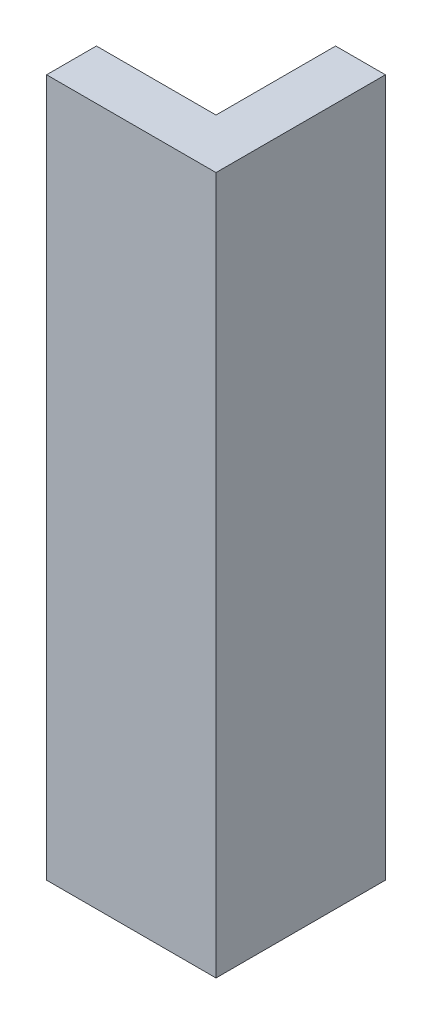
ISO-10303-21;
HEADER;
FILE_DESCRIPTION(('STEP AP214'),'2;1');
FILE_NAME('part.step','',(''),(''),'','','');
FILE_SCHEMA(('AUTOMOTIVE_DESIGN { 1 0 10303 214 1 1 1 1 }'));
ENDSEC;
DATA;
#1=APPLICATION_CONTEXT('core data for automotive mechanical design processes');
#2=APPLICATION_PROTOCOL_DEFINITION('international standard','automotive_design',2000,#1);
#3=PRODUCT_CONTEXT('',#1,'mechanical');
#4=PRODUCT('Part','Part','',(#3));
#5=PRODUCT_RELATED_PRODUCT_CATEGORY('part','',(#4));
#6=PRODUCT_DEFINITION_FORMATION('','',#4);
#7=PRODUCT_DEFINITION_CONTEXT('part definition',#1,'design');
#8=PRODUCT_DEFINITION('design','',#6,#7);
#9=PRODUCT_DEFINITION_SHAPE('','',#8);
#10=(LENGTH_UNIT() NAMED_UNIT(*) SI_UNIT(.MILLI.,.METRE.));
#11=(NAMED_UNIT(*) PLANE_ANGLE_UNIT() SI_UNIT($,.RADIAN.));
#12=(NAMED_UNIT(*) SI_UNIT($,.STERADIAN.) SOLID_ANGLE_UNIT());
#13=UNCERTAINTY_MEASURE_WITH_UNIT(LENGTH_MEASURE(1.E-05),#10,'distance_accuracy_value','');
#14=(GEOMETRIC_REPRESENTATION_CONTEXT(3) GLOBAL_UNCERTAINTY_ASSIGNED_CONTEXT((#13)) GLOBAL_UNIT_ASSIGNED_CONTEXT((#10,
#11,#12)) REPRESENTATION_CONTEXT('',''));
#15=CARTESIAN_POINT('',(0.,0.,0.));
#16=DIRECTION('',(0.,0.,1.));
#17=DIRECTION('',(1.,0.,0.));
#18=AXIS2_PLACEMENT_3D('',#15,#16,#17);
#19=CARTESIAN_POINT('',(0.,70.,0.));
#20=DIRECTION('',(1.,0.,0.));
#21=DIRECTION('',(0.,0.,-1.));
#22=AXIS2_PLACEMENT_3D('',#19,#20,#21);
#23=PLANE('',#22);
#24=DIRECTION('',(0.,0.,1.));
#25=VECTOR('',#24,1.);
#26=CARTESIAN_POINT('',(0.,70.,0.));
#27=LINE('',#26,#25);
#28=CARTESIAN_POINT('',(0.,70.,12.));
#29=VERTEX_POINT('',#28);
#30=CARTESIAN_POINT('',(0.,70.,17.));
#31=VERTEX_POINT('',#30);
#32=EDGE_CURVE('E90',#29,#31,#27,.T.);
#33=ORIENTED_EDGE('',*,*,#32,.F.);
#34=DIRECTION('',(0.,1.,0.));
#35=VECTOR('',#34,1.);
#36=CARTESIAN_POINT('',(0.,4.,12.));
#37=LINE('',#36,#35);
#38=CARTESIAN_POINT('',(0.,4.,12.));
#39=VERTEX_POINT('',#38);
#40=EDGE_CURVE('E56',#39,#29,#37,.T.);
#41=ORIENTED_EDGE('',*,*,#40,.F.);
#42=DIRECTION('',(0.,0.,1.));
#43=VECTOR('',#42,1.);
#44=CARTESIAN_POINT('',(0.,4.,0.));
#45=LINE('',#44,#43);
#46=CARTESIAN_POINT('',(0.,4.,0.));
#47=VERTEX_POINT('',#46);
#48=EDGE_CURVE('E118',#47,#39,#45,.T.);
#49=ORIENTED_EDGE('',*,*,#48,.F.);
#50=DIRECTION('',(0.,-1.,0.));
#51=VECTOR('',#50,1.);
#52=CARTESIAN_POINT('',(0.,70.,0.));
#53=LINE('',#52,#51);
#54=CARTESIAN_POINT('',(0.,0.,0.));
#55=VERTEX_POINT('',#54);
#56=EDGE_CURVE('E86',#47,#55,#53,.T.);
#57=ORIENTED_EDGE('',*,*,#56,.T.);
#58=DIRECTION('',(0.,0.,1.));
#59=VECTOR('',#58,1.);
#60=CARTESIAN_POINT('',(0.,0.,0.));
#61=LINE('',#60,#59);
#62=CARTESIAN_POINT('',(0.,0.,17.));
#63=VERTEX_POINT('',#62);
#64=EDGE_CURVE('E147',#55,#63,#61,.T.);
#65=ORIENTED_EDGE('',*,*,#64,.T.);
#66=DIRECTION('',(0.,-1.,0.));
#67=VECTOR('',#66,1.);
#68=CARTESIAN_POINT('',(0.,70.,17.));
#69=LINE('',#68,#67);
#70=EDGE_CURVE('E11',#31,#63,#69,.T.);
#71=ORIENTED_EDGE('',*,*,#70,.F.);
#72=EDGE_LOOP('',(#33,#41,#49,#57,#65,#71));
#73=FACE_BOUND('',#72,.T.);
#74=ADVANCED_FACE('F39',(#73),#23,.F.);
#75=CARTESIAN_POINT('',(0.,70.,17.));
#76=DIRECTION('',(0.,0.,-1.));
#77=DIRECTION('',(-1.,0.,0.));
#78=AXIS2_PLACEMENT_3D('',#75,#76,#77);
#79=PLANE('',#78);
#80=DIRECTION('',(1.,0.,0.));
#81=VECTOR('',#80,1.);
#82=CARTESIAN_POINT('',(0.,0.,17.));
#83=LINE('',#82,#81);
#84=CARTESIAN_POINT('',(17.,0.,17.));
#85=VERTEX_POINT('',#84);
#86=EDGE_CURVE('E150',#63,#85,#83,.T.);
#87=ORIENTED_EDGE('',*,*,#86,.T.);
#88=DIRECTION('',(0.,-1.,0.));
#89=VECTOR('',#88,1.);
#90=CARTESIAN_POINT('',(17.,70.,17.));
#91=LINE('',#90,#89);
#92=CARTESIAN_POINT('',(17.,70.,17.));
#93=VERTEX_POINT('',#92);
#94=EDGE_CURVE('E48',#93,#85,#91,.T.);
#95=ORIENTED_EDGE('',*,*,#94,.F.);
#96=DIRECTION('',(1.,0.,0.));
#97=VECTOR('',#96,1.);
#98=CARTESIAN_POINT('',(0.,70.,17.));
#99=LINE('',#98,#97);
#100=EDGE_CURVE('E138',#31,#93,#99,.T.);
#101=ORIENTED_EDGE('',*,*,#100,.F.);
#102=ORIENTED_EDGE('',*,*,#70,.T.);
#103=EDGE_LOOP('',(#87,#95,#101,#102));
#104=FACE_BOUND('',#103,.T.);
#105=ADVANCED_FACE('F230',(#104),#79,.F.);
#106=CARTESIAN_POINT('',(17.,70.,0.));
#107=DIRECTION('',(-1.,0.,0.));
#108=DIRECTION('',(0.,0.,1.));
#109=AXIS2_PLACEMENT_3D('',#106,#107,#108);
#110=PLANE('',#109);
#111=DIRECTION('',(0.,0.,-1.));
#112=VECTOR('',#111,1.);
#113=CARTESIAN_POINT('',(17.,0.,0.));
#114=LINE('',#113,#112);
#115=CARTESIAN_POINT('',(17.,0.,0.));
#116=VERTEX_POINT('',#115);
#117=EDGE_CURVE('E153',#85,#116,#114,.T.);
#118=ORIENTED_EDGE('',*,*,#117,.T.);
#119=DIRECTION('',(0.,-1.,0.));
#120=VECTOR('',#119,1.);
#121=CARTESIAN_POINT('',(17.,70.,0.));
#122=LINE('',#121,#120);
#123=CARTESIAN_POINT('',(17.,70.,0.));
#124=VERTEX_POINT('',#123);
#125=EDGE_CURVE('E160',#124,#116,#122,.T.);
#126=ORIENTED_EDGE('',*,*,#125,.F.);
#127=DIRECTION('',(0.,0.,-1.));
#128=VECTOR('',#127,1.);
#129=CARTESIAN_POINT('',(17.,70.,0.));
#130=LINE('',#129,#128);
#131=EDGE_CURVE('E65',#93,#124,#130,.T.);
#132=ORIENTED_EDGE('',*,*,#131,.F.);
#133=ORIENTED_EDGE('',*,*,#94,.T.);
#134=EDGE_LOOP('',(#118,#126,#132,#133));
#135=FACE_BOUND('',#134,.T.);
#136=ADVANCED_FACE('F233',(#135),#110,.F.);
#137=CARTESIAN_POINT('',(0.,70.,0.));
#138=DIRECTION('',(0.,0.,1.));
#139=DIRECTION('',(1.,0.,0.));
#140=AXIS2_PLACEMENT_3D('',#137,#138,#139);
#141=PLANE('',#140);
#142=DIRECTION('',(-1.,0.,0.));
#143=VECTOR('',#142,1.);
#144=CARTESIAN_POINT('',(0.,4.,0.));
#145=LINE('',#144,#143);
#146=CARTESIAN_POINT('',(12.,4.,0.));
#147=VERTEX_POINT('',#146);
#148=EDGE_CURVE('E122',#147,#47,#145,.T.);
#149=ORIENTED_EDGE('',*,*,#148,.F.);
#150=DIRECTION('',(0.,1.,0.));
#151=VECTOR('',#150,1.);
#152=CARTESIAN_POINT('',(12.,4.,0.));
#153=LINE('',#152,#151);
#154=CARTESIAN_POINT('',(12.,70.,0.));
#155=VERTEX_POINT('',#154);
#156=EDGE_CURVE('E131',#147,#155,#153,.T.);
#157=ORIENTED_EDGE('',*,*,#156,.T.);
#158=DIRECTION('',(-1.,0.,0.));
#159=VECTOR('',#158,1.);
#160=CARTESIAN_POINT('',(0.,70.,0.));
#161=LINE('',#160,#159);
#162=EDGE_CURVE('E144',#124,#155,#161,.T.);
#163=ORIENTED_EDGE('',*,*,#162,.F.);
#164=ORIENTED_EDGE('',*,*,#125,.T.);
#165=DIRECTION('',(-1.,0.,0.));
#166=VECTOR('',#165,1.);
#167=CARTESIAN_POINT('',(0.,0.,0.));
#168=LINE('',#167,#166);
#169=EDGE_CURVE('E139',#116,#55,#168,.T.);
#170=ORIENTED_EDGE('',*,*,#169,.T.);
#171=ORIENTED_EDGE('',*,*,#56,.F.);
#172=EDGE_LOOP('',(#149,#157,#163,#164,#170,#171));
#173=FACE_BOUND('',#172,.T.);
#174=ADVANCED_FACE('F195',(#173),#141,.F.);
#175=CARTESIAN_POINT('',(0.,70.,0.));
#176=DIRECTION('',(0.,1.,0.));
#177=DIRECTION('',(0.,0.,1.));
#178=AXIS2_PLACEMENT_3D('',#175,#176,#177);
#179=PLANE('',#178);
#180=DIRECTION('',(0.,0.,-1.));
#181=VECTOR('',#180,1.);
#182=CARTESIAN_POINT('',(12.,70.,0.));
#183=LINE('',#182,#181);
#184=CARTESIAN_POINT('',(12.,70.,12.));
#185=VERTEX_POINT('',#184);
#186=EDGE_CURVE('E124',#185,#155,#183,.T.);
#187=ORIENTED_EDGE('',*,*,#186,.F.);
#188=DIRECTION('',(1.,0.,0.));
#189=VECTOR('',#188,1.);
#190=CARTESIAN_POINT('',(0.,70.,12.));
#191=LINE('',#190,#189);
#192=EDGE_CURVE('E182',#29,#185,#191,.T.);
#193=ORIENTED_EDGE('',*,*,#192,.F.);
#194=ORIENTED_EDGE('',*,*,#32,.T.);
#195=ORIENTED_EDGE('',*,*,#100,.T.);
#196=ORIENTED_EDGE('',*,*,#131,.T.);
#197=ORIENTED_EDGE('',*,*,#162,.T.);
#198=EDGE_LOOP('',(#187,#193,#194,#195,#196,#197));
#199=FACE_BOUND('',#198,.T.);
#200=ADVANCED_FACE('F197',(#199),#179,.T.);
#201=CARTESIAN_POINT('',(0.,0.,0.));
#202=DIRECTION('',(0.,1.,0.));
#203=DIRECTION('',(0.,0.,1.));
#204=AXIS2_PLACEMENT_3D('',#201,#202,#203);
#205=PLANE('',#204);
#206=CARTESIAN_POINT('',(2.4254686312528,0.,2.4254686312528));
#207=DIRECTION('',(0.,-1.,0.));
#208=DIRECTION('',(0.,0.,-1.));
#209=AXIS2_PLACEMENT_3D('',#206,#207,#208);
#210=CIRCLE('',#209,1.5);
#211=CARTESIAN_POINT('',(2.4254686312528,0.,0.9254686312528));
#212=VERTEX_POINT('',#211);
#213=EDGE_CURVE('E204',#212,#212,#210,.T.);
#214=ORIENTED_EDGE('',*,*,#213,.F.);
#215=EDGE_LOOP('',(#214));
#216=FACE_BOUND('',#215,.T.);
#217=CARTESIAN_POINT('',(9.57453136874721,0.,9.57453136874721));
#218=DIRECTION('',(0.,-1.,0.));
#219=DIRECTION('',(0.,0.,-1.));
#220=AXIS2_PLACEMENT_3D('',#217,#218,#219);
#221=CIRCLE('',#220,1.5);
#222=CARTESIAN_POINT('',(9.57453136874721,0.,8.07453136874721));
#223=VERTEX_POINT('',#222);
#224=EDGE_CURVE('E205',#223,#223,#221,.T.);
#225=ORIENTED_EDGE('',*,*,#224,.F.);
#226=EDGE_LOOP('',(#225));
#227=FACE_BOUND('',#226,.T.);
#228=CARTESIAN_POINT('',(2.4254686312528,0.,9.5745313687472));
#229=DIRECTION('',(0.,-1.,0.));
#230=DIRECTION('',(0.,0.,-1.));
#231=AXIS2_PLACEMENT_3D('',#228,#229,#230);
#232=CIRCLE('',#231,1.5);
#233=CARTESIAN_POINT('',(2.4254686312528,0.,8.0745313687472));
#234=VERTEX_POINT('',#233);
#235=EDGE_CURVE('E209',#234,#234,#232,.T.);
#236=ORIENTED_EDGE('',*,*,#235,.F.);
#237=EDGE_LOOP('',(#236));
#238=FACE_BOUND('',#237,.T.);
#239=CARTESIAN_POINT('',(9.57453136874721,0.,2.4254686312528));
#240=DIRECTION('',(0.,-1.,0.));
#241=DIRECTION('',(0.,0.,-1.));
#242=AXIS2_PLACEMENT_3D('',#239,#240,#241);
#243=CIRCLE('',#242,1.5);
#244=CARTESIAN_POINT('',(9.57453136874721,0.,0.925468631252802));
#245=VERTEX_POINT('',#244);
#246=EDGE_CURVE('E172',#245,#245,#243,.T.);
#247=ORIENTED_EDGE('',*,*,#246,.F.);
#248=EDGE_LOOP('',(#247));
#249=FACE_BOUND('',#248,.T.);
#250=ORIENTED_EDGE('',*,*,#64,.F.);
#251=ORIENTED_EDGE('',*,*,#169,.F.);
#252=ORIENTED_EDGE('',*,*,#117,.F.);
#253=ORIENTED_EDGE('',*,*,#86,.F.);
#254=EDGE_LOOP('',(#250,#251,#252,#253));
#255=FACE_BOUND('',#254,.T.);
#256=ADVANCED_FACE('F219',(#216,#227,#238,#249,#255),#205,.F.);
#257=CARTESIAN_POINT('',(12.,4.,0.));
#258=DIRECTION('',(1.,0.,0.));
#259=DIRECTION('',(0.,0.,-1.));
#260=AXIS2_PLACEMENT_3D('',#257,#258,#259);
#261=PLANE('',#260);
#262=ORIENTED_EDGE('',*,*,#186,.T.);
#263=ORIENTED_EDGE('',*,*,#156,.F.);
#264=DIRECTION('',(0.,0.,-1.));
#265=VECTOR('',#264,1.);
#266=CARTESIAN_POINT('',(12.,4.,0.));
#267=LINE('',#266,#265);
#268=CARTESIAN_POINT('',(12.,4.,12.));
#269=VERTEX_POINT('',#268);
#270=EDGE_CURVE('E117',#269,#147,#267,.T.);
#271=ORIENTED_EDGE('',*,*,#270,.F.);
#272=DIRECTION('',(0.,1.,0.));
#273=VECTOR('',#272,1.);
#274=CARTESIAN_POINT('',(12.,4.,12.));
#275=LINE('',#274,#273);
#276=EDGE_CURVE('E112',#269,#185,#275,.T.);
#277=ORIENTED_EDGE('',*,*,#276,.T.);
#278=EDGE_LOOP('',(#262,#263,#271,#277));
#279=FACE_BOUND('',#278,.T.);
#280=ADVANCED_FACE('F198',(#279),#261,.F.);
#281=CARTESIAN_POINT('',(0.,4.,12.));
#282=DIRECTION('',(0.,0.,1.));
#283=DIRECTION('',(1.,0.,0.));
#284=AXIS2_PLACEMENT_3D('',#281,#282,#283);
#285=PLANE('',#284);
#286=ORIENTED_EDGE('',*,*,#192,.T.);
#287=ORIENTED_EDGE('',*,*,#276,.F.);
#288=DIRECTION('',(1.,0.,0.));
#289=VECTOR('',#288,1.);
#290=CARTESIAN_POINT('',(0.,4.,12.));
#291=LINE('',#290,#289);
#292=EDGE_CURVE('E109',#39,#269,#291,.T.);
#293=ORIENTED_EDGE('',*,*,#292,.F.);
#294=ORIENTED_EDGE('',*,*,#40,.T.);
#295=EDGE_LOOP('',(#286,#287,#293,#294));
#296=FACE_BOUND('',#295,.T.);
#297=ADVANCED_FACE('F111',(#296),#285,.F.);
#298=CARTESIAN_POINT('',(0.,4.,0.));
#299=DIRECTION('',(0.,1.,0.));
#300=DIRECTION('',(0.,0.,1.));
#301=AXIS2_PLACEMENT_3D('',#298,#299,#300);
#302=PLANE('',#301);
#303=CARTESIAN_POINT('',(2.4254686312528,4.,2.4254686312528));
#304=DIRECTION('',(0.,1.,0.));
#305=DIRECTION('',(0.,0.,1.));
#306=AXIS2_PLACEMENT_3D('',#303,#304,#305);
#307=CIRCLE('',#306,1.5);
#308=CARTESIAN_POINT('',(2.4254686312528,4.,3.9254686312528));
#309=VERTEX_POINT('',#308);
#310=EDGE_CURVE('E42',#309,#309,#307,.T.);
#311=ORIENTED_EDGE('',*,*,#310,.F.);
#312=EDGE_LOOP('',(#311));
#313=FACE_BOUND('',#312,.T.);
#314=CARTESIAN_POINT('',(9.57453136874721,4.,9.57453136874721));
#315=DIRECTION('',(0.,1.,0.));
#316=DIRECTION('',(0.,0.,1.));
#317=AXIS2_PLACEMENT_3D('',#314,#315,#316);
#318=CIRCLE('',#317,1.5);
#319=CARTESIAN_POINT('',(9.57453136874721,4.,11.0745313687472));
#320=VERTEX_POINT('',#319);
#321=EDGE_CURVE('E175',#320,#320,#318,.T.);
#322=ORIENTED_EDGE('',*,*,#321,.F.);
#323=EDGE_LOOP('',(#322));
#324=FACE_BOUND('',#323,.T.);
#325=CARTESIAN_POINT('',(2.4254686312528,4.,9.5745313687472));
#326=DIRECTION('',(0.,1.,0.));
#327=DIRECTION('',(0.,0.,1.));
#328=AXIS2_PLACEMENT_3D('',#325,#326,#327);
#329=CIRCLE('',#328,1.5);
#330=CARTESIAN_POINT('',(2.4254686312528,4.,11.0745313687472));
#331=VERTEX_POINT('',#330);
#332=EDGE_CURVE('E171',#331,#331,#329,.T.);
#333=ORIENTED_EDGE('',*,*,#332,.F.);
#334=EDGE_LOOP('',(#333));
#335=FACE_BOUND('',#334,.T.);
#336=CARTESIAN_POINT('',(9.57453136874721,4.,2.4254686312528));
#337=DIRECTION('',(0.,1.,0.));
#338=DIRECTION('',(0.,0.,1.));
#339=AXIS2_PLACEMENT_3D('',#336,#337,#338);
#340=CIRCLE('',#339,1.5);
#341=CARTESIAN_POINT('',(9.57453136874721,4.,3.9254686312528));
#342=VERTEX_POINT('',#341);
#343=EDGE_CURVE('E167',#342,#342,#340,.T.);
#344=ORIENTED_EDGE('',*,*,#343,.F.);
#345=EDGE_LOOP('',(#344));
#346=FACE_BOUND('',#345,.T.);
#347=ORIENTED_EDGE('',*,*,#48,.T.);
#348=ORIENTED_EDGE('',*,*,#292,.T.);
#349=ORIENTED_EDGE('',*,*,#270,.T.);
#350=ORIENTED_EDGE('',*,*,#148,.T.);
#351=EDGE_LOOP('',(#347,#348,#349,#350));
#352=FACE_BOUND('',#351,.T.);
#353=ADVANCED_FACE('F120',(#313,#324,#335,#346,#352),#302,.T.);
#354=CARTESIAN_POINT('',(9.57453136874721,7.99999999999999,2.4254686312528));
#355=DIRECTION('',(0.,-1.,0.));
#356=DIRECTION('',(0.,0.,-1.));
#357=AXIS2_PLACEMENT_3D('',#354,#355,#356);
#358=CYLINDRICAL_SURFACE('',#357,1.5);
#359=ORIENTED_EDGE('',*,*,#343,.T.);
#360=EDGE_LOOP('',(#359));
#361=FACE_BOUND('',#360,.T.);
#362=ORIENTED_EDGE('',*,*,#246,.T.);
#363=EDGE_LOOP('',(#362));
#364=FACE_BOUND('',#363,.T.);
#365=ADVANCED_FACE('F293',(#361,#364),#358,.F.);
#366=CARTESIAN_POINT('',(2.4254686312528,7.99999999999999,9.5745313687472));
#367=DIRECTION('',(0.,-1.,0.));
#368=DIRECTION('',(0.,0.,-1.));
#369=AXIS2_PLACEMENT_3D('',#366,#367,#368);
#370=CYLINDRICAL_SURFACE('',#369,1.5);
#371=ORIENTED_EDGE('',*,*,#332,.T.);
#372=EDGE_LOOP('',(#371));
#373=FACE_BOUND('',#372,.T.);
#374=ORIENTED_EDGE('',*,*,#235,.T.);
#375=EDGE_LOOP('',(#374));
#376=FACE_BOUND('',#375,.T.);
#377=ADVANCED_FACE('F217',(#373,#376),#370,.F.);
#378=CARTESIAN_POINT('',(9.57453136874721,7.99999999999999,9.57453136874721));
#379=DIRECTION('',(0.,-1.,0.));
#380=DIRECTION('',(0.,0.,-1.));
#381=AXIS2_PLACEMENT_3D('',#378,#379,#380);
#382=CYLINDRICAL_SURFACE('',#381,1.5);
#383=ORIENTED_EDGE('',*,*,#321,.T.);
#384=EDGE_LOOP('',(#383));
#385=FACE_BOUND('',#384,.T.);
#386=ORIENTED_EDGE('',*,*,#224,.T.);
#387=EDGE_LOOP('',(#386));
#388=FACE_BOUND('',#387,.T.);
#389=ADVANCED_FACE('F310',(#385,#388),#382,.F.);
#390=CARTESIAN_POINT('',(2.4254686312528,7.99999999999999,2.4254686312528));
#391=DIRECTION('',(0.,-1.,0.));
#392=DIRECTION('',(0.,0.,-1.));
#393=AXIS2_PLACEMENT_3D('',#390,#391,#392);
#394=CYLINDRICAL_SURFACE('',#393,1.5);
#395=ORIENTED_EDGE('',*,*,#310,.T.);
#396=EDGE_LOOP('',(#395));
#397=FACE_BOUND('',#396,.T.);
#398=ORIENTED_EDGE('',*,*,#213,.T.);
#399=EDGE_LOOP('',(#398));
#400=FACE_BOUND('',#399,.T.);
#401=ADVANCED_FACE('F319',(#397,#400),#394,.F.);
#402=CLOSED_SHELL('',(#74,#105,#136,#174,#200,#256,#280,#297,#353,#365,#377,#389,#401));
#403=MANIFOLD_SOLID_BREP('B2',#402);
#404=ADVANCED_BREP_SHAPE_REPRESENTATION('',(#18,#403),#14);
#405=SHAPE_DEFINITION_REPRESENTATION(#9,#404);
ENDSEC;
END-ISO-10303-21;
